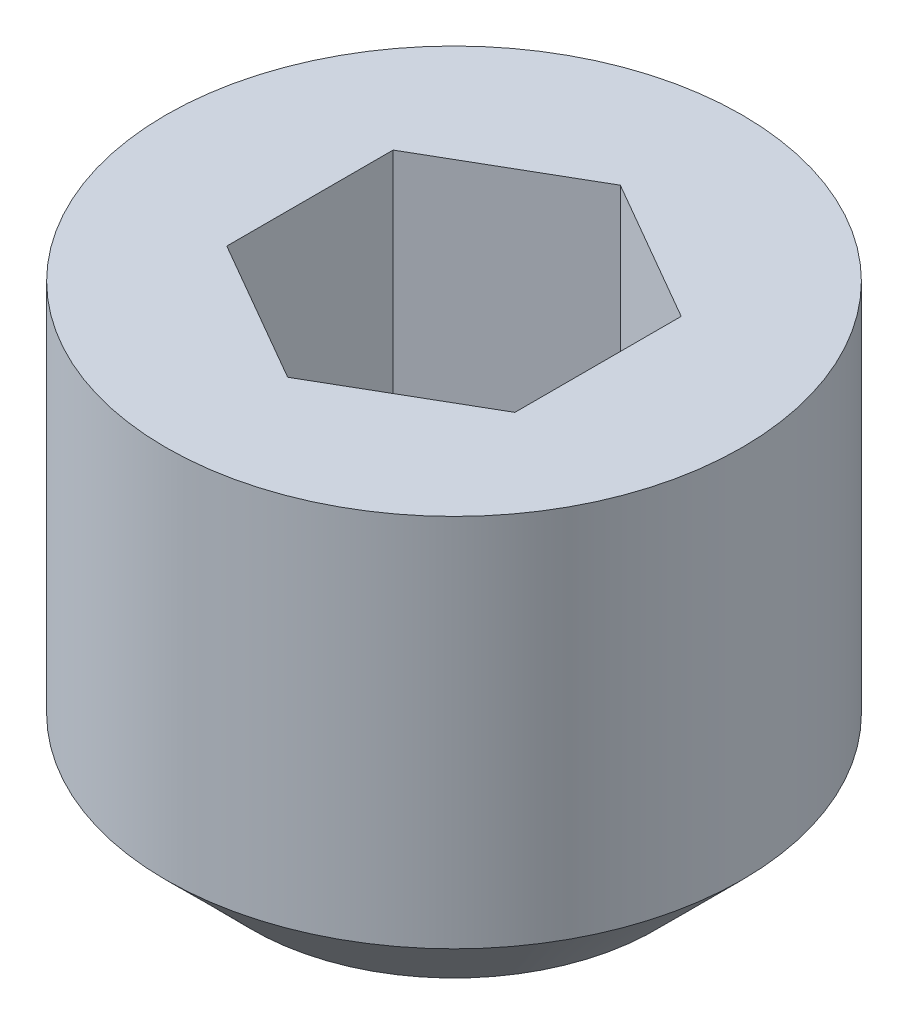
ISO-10303-21;
HEADER;
FILE_DESCRIPTION(('STEP AP214'),'2;1');
FILE_NAME('part.step','',(''),(''),'','','');
FILE_SCHEMA(('AUTOMOTIVE_DESIGN { 1 0 10303 214 1 1 1 1 }'));
ENDSEC;
DATA;
#1=APPLICATION_CONTEXT('core data for automotive mechanical design processes');
#2=APPLICATION_PROTOCOL_DEFINITION('international standard','automotive_design',2000,#1);
#3=PRODUCT_CONTEXT('',#1,'mechanical');
#4=PRODUCT('Part','Part','',(#3));
#5=PRODUCT_RELATED_PRODUCT_CATEGORY('part','',(#4));
#6=PRODUCT_DEFINITION_FORMATION('','',#4);
#7=PRODUCT_DEFINITION_CONTEXT('part definition',#1,'design');
#8=PRODUCT_DEFINITION('design','',#6,#7);
#9=PRODUCT_DEFINITION_SHAPE('','',#8);
#10=(LENGTH_UNIT() NAMED_UNIT(*) SI_UNIT(.MILLI.,.METRE.));
#11=(NAMED_UNIT(*) PLANE_ANGLE_UNIT() SI_UNIT($,.RADIAN.));
#12=(NAMED_UNIT(*) SI_UNIT($,.STERADIAN.) SOLID_ANGLE_UNIT());
#13=UNCERTAINTY_MEASURE_WITH_UNIT(LENGTH_MEASURE(1.E-05),#10,'distance_accuracy_value','');
#14=(GEOMETRIC_REPRESENTATION_CONTEXT(3) GLOBAL_UNCERTAINTY_ASSIGNED_CONTEXT((#13)) GLOBAL_UNIT_ASSIGNED_CONTEXT((#10,
#11,#12)) REPRESENTATION_CONTEXT('',''));
#15=CARTESIAN_POINT('',(0.,0.,0.));
#16=DIRECTION('',(0.,0.,1.));
#17=DIRECTION('',(1.,0.,0.));
#18=AXIS2_PLACEMENT_3D('',#15,#16,#17);
#19=CARTESIAN_POINT('',(0.,4.,0.));
#20=DIRECTION('',(0.,1.,0.));
#21=DIRECTION('',(-1.,0.,0.));
#22=AXIS2_PLACEMENT_3D('',#19,#20,#21);
#23=CYLINDRICAL_SURFACE('',#22,2.5);
#24=CARTESIAN_POINT('',(0.,4.,0.));
#25=DIRECTION('',(0.,1.,0.));
#26=DIRECTION('',(-1.,0.,0.));
#27=AXIS2_PLACEMENT_3D('',#24,#25,#26);
#28=CIRCLE('',#27,2.5);
#29=CARTESIAN_POINT('',(-2.5,4.,0.));
#30=VERTEX_POINT('',#29);
#31=EDGE_CURVE('E11',#30,#30,#28,.T.);
#32=ORIENTED_EDGE('',*,*,#31,.F.);
#33=EDGE_LOOP('',(#32));
#34=FACE_BOUND('',#33,.T.);
#35=CARTESIAN_POINT('',(0.,0.749999999999992,0.));
#36=DIRECTION('',(0.,1.,0.));
#37=DIRECTION('',(-1.,0.,0.));
#38=AXIS2_PLACEMENT_3D('',#35,#36,#37);
#39=CIRCLE('',#38,2.5);
#40=CARTESIAN_POINT('',(-2.5,0.749999999999991,0.));
#41=VERTEX_POINT('',#40);
#42=EDGE_CURVE('E152',#41,#41,#39,.T.);
#43=ORIENTED_EDGE('',*,*,#42,.T.);
#44=EDGE_LOOP('',(#43));
#45=FACE_BOUND('',#44,.T.);
#46=ADVANCED_FACE('F36',(#34,#45),#23,.T.);
#47=CARTESIAN_POINT('',(0.,4.,0.));
#48=DIRECTION('',(0.,-1.,0.));
#49=DIRECTION('',(1.,0.,0.));
#50=AXIS2_PLACEMENT_3D('',#47,#48,#49);
#51=PLANE('',#50);
#52=ORIENTED_EDGE('',*,*,#31,.T.);
#53=EDGE_LOOP('',(#52));
#54=FACE_BOUND('',#53,.T.);
#55=DIRECTION('',(-0.866025403784439,0.,0.5));
#56=VECTOR('',#55,1.);
#57=CARTESIAN_POINT('',(0.,4.,-1.44337567297406));
#58=LINE('',#57,#56);
#59=CARTESIAN_POINT('',(0.,4.,-1.44337567297406));
#60=VERTEX_POINT('',#59);
#61=CARTESIAN_POINT('',(-1.25,4.,-0.721687836487032));
#62=VERTEX_POINT('',#61);
#63=EDGE_CURVE('E151',#60,#62,#58,.T.);
#64=ORIENTED_EDGE('',*,*,#63,.F.);
#65=DIRECTION('',(-0.866025403784439,0.,-0.5));
#66=VECTOR('',#65,1.);
#67=CARTESIAN_POINT('',(1.25,4.,-0.721687836487032));
#68=LINE('',#67,#66);
#69=CARTESIAN_POINT('',(1.25,4.,-0.721687836487032));
#70=VERTEX_POINT('',#69);
#71=EDGE_CURVE('E51',#70,#60,#68,.T.);
#72=ORIENTED_EDGE('',*,*,#71,.F.);
#73=DIRECTION('',(0.,0.,-1.));
#74=VECTOR('',#73,1.);
#75=CARTESIAN_POINT('',(1.25,4.,0.721687836487032));
#76=LINE('',#75,#74);
#77=CARTESIAN_POINT('',(1.25,4.,0.721687836487032));
#78=VERTEX_POINT('',#77);
#79=EDGE_CURVE('E121',#78,#70,#76,.T.);
#80=ORIENTED_EDGE('',*,*,#79,.F.);
#81=DIRECTION('',(0.866025403784439,0.,-0.5));
#82=VECTOR('',#81,1.);
#83=CARTESIAN_POINT('',(0.,4.,1.44337567297406));
#84=LINE('',#83,#82);
#85=CARTESIAN_POINT('',(0.,4.,1.44337567297406));
#86=VERTEX_POINT('',#85);
#87=EDGE_CURVE('E159',#86,#78,#84,.T.);
#88=ORIENTED_EDGE('',*,*,#87,.F.);
#89=DIRECTION('',(0.866025403784439,0.,0.5));
#90=VECTOR('',#89,1.);
#91=CARTESIAN_POINT('',(-1.25,4.,0.721687836487032));
#92=LINE('',#91,#90);
#93=CARTESIAN_POINT('',(-1.25,4.,0.721687836487032));
#94=VERTEX_POINT('',#93);
#95=EDGE_CURVE('E156',#94,#86,#92,.T.);
#96=ORIENTED_EDGE('',*,*,#95,.F.);
#97=DIRECTION('',(0.,0.,1.));
#98=VECTOR('',#97,1.);
#99=CARTESIAN_POINT('',(-1.25,4.,-0.721687836487032));
#100=LINE('',#99,#98);
#101=EDGE_CURVE('E154',#62,#94,#100,.T.);
#102=ORIENTED_EDGE('',*,*,#101,.F.);
#103=EDGE_LOOP('',(#64,#72,#80,#88,#96,#102));
#104=FACE_BOUND('',#103,.T.);
#105=ADVANCED_FACE('F199',(#54,#104),#51,.F.);
#106=CARTESIAN_POINT('',(1.25,2.,-0.721687836487032));
#107=DIRECTION('',(0.5,0.,-0.866025403784439));
#108=DIRECTION('',(-0.866025403784439,0.,-0.5));
#109=AXIS2_PLACEMENT_3D('',#106,#107,#108);
#110=PLANE('',#109);
#111=DIRECTION('',(-0.866025403784439,0.,-0.5));
#112=VECTOR('',#111,1.);
#113=CARTESIAN_POINT('',(1.25,2.,-0.721687836487032));
#114=LINE('',#113,#112);
#115=CARTESIAN_POINT('',(1.25,2.,-0.721687836487032));
#116=VERTEX_POINT('',#115);
#117=CARTESIAN_POINT('',(0.625,2.,-1.08253175473055));
#118=VERTEX_POINT('',#117);
#119=EDGE_CURVE('E120',#116,#118,#114,.T.);
#120=ORIENTED_EDGE('',*,*,#119,.F.);
#121=DIRECTION('',(0.,1.,0.));
#122=VECTOR('',#121,1.);
#123=CARTESIAN_POINT('',(1.25,2.,-0.721687836487032));
#124=LINE('',#123,#122);
#125=EDGE_CURVE('E162',#116,#70,#124,.T.);
#126=ORIENTED_EDGE('',*,*,#125,.T.);
#127=ORIENTED_EDGE('',*,*,#71,.T.);
#128=DIRECTION('',(0.,1.,0.));
#129=VECTOR('',#128,1.);
#130=CARTESIAN_POINT('',(0.,2.,-1.44337567297406));
#131=LINE('',#130,#129);
#132=CARTESIAN_POINT('',(0.,2.,-1.44337567297406));
#133=VERTEX_POINT('',#132);
#134=EDGE_CURVE('E123',#133,#60,#131,.T.);
#135=ORIENTED_EDGE('',*,*,#134,.F.);
#136=EDGE_CURVE('E112',#118,#133,#114,.T.);
#137=ORIENTED_EDGE('',*,*,#136,.F.);
#138=EDGE_LOOP('',(#120,#126,#127,#135,#137));
#139=FACE_BOUND('',#138,.T.);
#140=ADVANCED_FACE('F124',(#139),#110,.F.);
#141=CARTESIAN_POINT('',(1.25,2.,0.721687836487032));
#142=DIRECTION('',(1.,0.,0.));
#143=DIRECTION('',(0.,1.,0.));
#144=AXIS2_PLACEMENT_3D('',#141,#142,#143);
#145=PLANE('',#144);
#146=DIRECTION('',(0.,0.,-1.));
#147=VECTOR('',#146,1.);
#148=CARTESIAN_POINT('',(1.25,2.,0.721687836487032));
#149=LINE('',#148,#147);
#150=CARTESIAN_POINT('',(1.25,2.,0.721687836487032));
#151=VERTEX_POINT('',#150);
#152=CARTESIAN_POINT('',(1.25,2.,0.));
#153=VERTEX_POINT('',#152);
#154=EDGE_CURVE('E128',#151,#153,#149,.T.);
#155=ORIENTED_EDGE('',*,*,#154,.F.);
#156=DIRECTION('',(0.,1.,0.));
#157=VECTOR('',#156,1.);
#158=CARTESIAN_POINT('',(1.25,2.,0.721687836487032));
#159=LINE('',#158,#157);
#160=EDGE_CURVE('E165',#151,#78,#159,.T.);
#161=ORIENTED_EDGE('',*,*,#160,.T.);
#162=ORIENTED_EDGE('',*,*,#79,.T.);
#163=ORIENTED_EDGE('',*,*,#125,.F.);
#164=EDGE_CURVE('E147',#153,#116,#149,.T.);
#165=ORIENTED_EDGE('',*,*,#164,.F.);
#166=EDGE_LOOP('',(#155,#161,#162,#163,#165));
#167=FACE_BOUND('',#166,.T.);
#168=ADVANCED_FACE('F193',(#167),#145,.F.);
#169=CARTESIAN_POINT('',(0.,2.,1.44337567297406));
#170=DIRECTION('',(0.5,0.,0.866025403784439));
#171=DIRECTION('',(0.866025403784439,0.,-0.5));
#172=AXIS2_PLACEMENT_3D('',#169,#170,#171);
#173=PLANE('',#172);
#174=DIRECTION('',(0.866025403784439,0.,-0.5));
#175=VECTOR('',#174,1.);
#176=CARTESIAN_POINT('',(0.,2.,1.44337567297406));
#177=LINE('',#176,#175);
#178=CARTESIAN_POINT('',(0.,2.,1.44337567297406));
#179=VERTEX_POINT('',#178);
#180=CARTESIAN_POINT('',(0.625,2.,1.08253175473055));
#181=VERTEX_POINT('',#180);
#182=EDGE_CURVE('E59',#179,#181,#177,.T.);
#183=ORIENTED_EDGE('',*,*,#182,.F.);
#184=DIRECTION('',(0.,1.,0.));
#185=VECTOR('',#184,1.);
#186=CARTESIAN_POINT('',(0.,2.,1.44337567297406));
#187=LINE('',#186,#185);
#188=EDGE_CURVE('E168',#179,#86,#187,.T.);
#189=ORIENTED_EDGE('',*,*,#188,.T.);
#190=ORIENTED_EDGE('',*,*,#87,.T.);
#191=ORIENTED_EDGE('',*,*,#160,.F.);
#192=EDGE_CURVE('E145',#181,#151,#177,.T.);
#193=ORIENTED_EDGE('',*,*,#192,.F.);
#194=EDGE_LOOP('',(#183,#189,#190,#191,#193));
#195=FACE_BOUND('',#194,.T.);
#196=ADVANCED_FACE('F242',(#195),#173,.F.);
#197=CARTESIAN_POINT('',(-1.25,2.,0.721687836487032));
#198=DIRECTION('',(-0.5,0.,0.866025403784439));
#199=DIRECTION('',(0.866025403784439,0.,0.5));
#200=AXIS2_PLACEMENT_3D('',#197,#198,#199);
#201=PLANE('',#200);
#202=DIRECTION('',(0.866025403784439,0.,0.5));
#203=VECTOR('',#202,1.);
#204=CARTESIAN_POINT('',(-1.25,2.,0.721687836487032));
#205=LINE('',#204,#203);
#206=CARTESIAN_POINT('',(-1.25,2.,0.721687836487032));
#207=VERTEX_POINT('',#206);
#208=CARTESIAN_POINT('',(-0.625,2.,1.08253175473055));
#209=VERTEX_POINT('',#208);
#210=EDGE_CURVE('E142',#207,#209,#205,.T.);
#211=ORIENTED_EDGE('',*,*,#210,.F.);
#212=DIRECTION('',(0.,1.,0.));
#213=VECTOR('',#212,1.);
#214=CARTESIAN_POINT('',(-1.25,2.,0.721687836487032));
#215=LINE('',#214,#213);
#216=EDGE_CURVE('E171',#207,#94,#215,.T.);
#217=ORIENTED_EDGE('',*,*,#216,.T.);
#218=ORIENTED_EDGE('',*,*,#95,.T.);
#219=ORIENTED_EDGE('',*,*,#188,.F.);
#220=EDGE_CURVE('E141',#209,#179,#205,.T.);
#221=ORIENTED_EDGE('',*,*,#220,.F.);
#222=EDGE_LOOP('',(#211,#217,#218,#219,#221));
#223=FACE_BOUND('',#222,.T.);
#224=ADVANCED_FACE('F239',(#223),#201,.F.);
#225=CARTESIAN_POINT('',(-1.25,2.,-0.721687836487032));
#226=DIRECTION('',(-1.,0.,0.));
#227=DIRECTION('',(0.,-1.,0.));
#228=AXIS2_PLACEMENT_3D('',#225,#226,#227);
#229=PLANE('',#228);
#230=DIRECTION('',(0.,0.,1.));
#231=VECTOR('',#230,1.);
#232=CARTESIAN_POINT('',(-1.25,2.,-0.721687836487032));
#233=LINE('',#232,#231);
#234=CARTESIAN_POINT('',(-1.25,2.,-0.721687836487032));
#235=VERTEX_POINT('',#234);
#236=CARTESIAN_POINT('',(-1.25,2.,0.));
#237=VERTEX_POINT('',#236);
#238=EDGE_CURVE('E136',#235,#237,#233,.T.);
#239=ORIENTED_EDGE('',*,*,#238,.F.);
#240=DIRECTION('',(0.,1.,0.));
#241=VECTOR('',#240,1.);
#242=CARTESIAN_POINT('',(-1.25,2.,-0.721687836487032));
#243=LINE('',#242,#241);
#244=EDGE_CURVE('E127',#235,#62,#243,.T.);
#245=ORIENTED_EDGE('',*,*,#244,.T.);
#246=ORIENTED_EDGE('',*,*,#101,.T.);
#247=ORIENTED_EDGE('',*,*,#216,.F.);
#248=EDGE_CURVE('E134',#237,#207,#233,.T.);
#249=ORIENTED_EDGE('',*,*,#248,.F.);
#250=EDGE_LOOP('',(#239,#245,#246,#247,#249));
#251=FACE_BOUND('',#250,.T.);
#252=ADVANCED_FACE('F204',(#251),#229,.F.);
#253=CARTESIAN_POINT('',(0.,2.,-1.44337567297406));
#254=DIRECTION('',(-0.5,0.,-0.866025403784439));
#255=DIRECTION('',(-0.866025403784439,0.,0.5));
#256=AXIS2_PLACEMENT_3D('',#253,#254,#255);
#257=PLANE('',#256);
#258=DIRECTION('',(-0.866025403784439,0.,0.5));
#259=VECTOR('',#258,1.);
#260=CARTESIAN_POINT('',(0.,2.,-1.44337567297406));
#261=LINE('',#260,#259);
#262=CARTESIAN_POINT('',(-0.625,2.,-1.08253175473055));
#263=VERTEX_POINT('',#262);
#264=EDGE_CURVE('E115',#133,#263,#261,.T.);
#265=ORIENTED_EDGE('',*,*,#264,.F.);
#266=ORIENTED_EDGE('',*,*,#134,.T.);
#267=ORIENTED_EDGE('',*,*,#63,.T.);
#268=ORIENTED_EDGE('',*,*,#244,.F.);
#269=EDGE_CURVE('E133',#263,#235,#261,.T.);
#270=ORIENTED_EDGE('',*,*,#269,.F.);
#271=EDGE_LOOP('',(#265,#266,#267,#268,#270));
#272=FACE_BOUND('',#271,.T.);
#273=ADVANCED_FACE('F131',(#272),#257,.F.);
#274=CARTESIAN_POINT('',(0.,2.,0.));
#275=DIRECTION('',(0.,1.,0.));
#276=DIRECTION('',(0.,0.,1.));
#277=AXIS2_PLACEMENT_3D('',#274,#275,#276);
#278=PLANE('',#277);
#279=ORIENTED_EDGE('',*,*,#192,.T.);
#280=ORIENTED_EDGE('',*,*,#154,.T.);
#281=CARTESIAN_POINT('',(0.,2.,0.));
#282=DIRECTION('',(0.,1.,0.));
#283=DIRECTION('',(-1.,0.,0.));
#284=AXIS2_PLACEMENT_3D('',#281,#282,#283);
#285=CIRCLE('',#284,1.25);
#286=EDGE_CURVE('E180',#181,#153,#285,.T.);
#287=ORIENTED_EDGE('',*,*,#286,.F.);
#288=EDGE_LOOP('',(#279,#280,#287));
#289=FACE_BOUND('',#288,.T.);
#290=ADVANCED_FACE('F188',(#289),#278,.T.);
#291=ORIENTED_EDGE('',*,*,#164,.T.);
#292=ORIENTED_EDGE('',*,*,#119,.T.);
#293=EDGE_CURVE('E181',#153,#118,#285,.T.);
#294=ORIENTED_EDGE('',*,*,#293,.F.);
#295=EDGE_LOOP('',(#291,#292,#294));
#296=FACE_BOUND('',#295,.T.);
#297=ADVANCED_FACE('F197',(#296),#278,.T.);
#298=ORIENTED_EDGE('',*,*,#136,.T.);
#299=ORIENTED_EDGE('',*,*,#264,.T.);
#300=EDGE_CURVE('E117',#118,#263,#285,.T.);
#301=ORIENTED_EDGE('',*,*,#300,.F.);
#302=EDGE_LOOP('',(#298,#299,#301));
#303=FACE_BOUND('',#302,.T.);
#304=ADVANCED_FACE('F113',(#303),#278,.T.);
#305=ORIENTED_EDGE('',*,*,#269,.T.);
#306=ORIENTED_EDGE('',*,*,#238,.T.);
#307=EDGE_CURVE('E164',#263,#237,#285,.T.);
#308=ORIENTED_EDGE('',*,*,#307,.F.);
#309=EDGE_LOOP('',(#305,#306,#308));
#310=FACE_BOUND('',#309,.T.);
#311=ADVANCED_FACE('F208',(#310),#278,.T.);
#312=ORIENTED_EDGE('',*,*,#248,.T.);
#313=ORIENTED_EDGE('',*,*,#210,.T.);
#314=EDGE_CURVE('E44',#237,#209,#285,.T.);
#315=ORIENTED_EDGE('',*,*,#314,.F.);
#316=EDGE_LOOP('',(#312,#313,#315));
#317=FACE_BOUND('',#316,.T.);
#318=ADVANCED_FACE('F210',(#317),#278,.T.);
#319=ORIENTED_EDGE('',*,*,#220,.T.);
#320=ORIENTED_EDGE('',*,*,#182,.T.);
#321=EDGE_CURVE('E176',#209,#181,#285,.T.);
#322=ORIENTED_EDGE('',*,*,#321,.F.);
#323=EDGE_LOOP('',(#319,#320,#322));
#324=FACE_BOUND('',#323,.T.);
#325=ADVANCED_FACE('F216',(#324),#278,.T.);
#326=CARTESIAN_POINT('',(0.,1.27831216351296,0.));
#327=DIRECTION('',(0.,1.,0.));
#328=DIRECTION('',(-1.,0.,0.));
#329=AXIS2_PLACEMENT_3D('',#326,#327,#328);
#330=CONICAL_SURFACE('',#329,0.,1.04719755119659);
#331=ORIENTED_EDGE('',*,*,#314,.T.);
#332=ORIENTED_EDGE('',*,*,#321,.T.);
#333=ORIENTED_EDGE('',*,*,#286,.T.);
#334=ORIENTED_EDGE('',*,*,#293,.T.);
#335=ORIENTED_EDGE('',*,*,#300,.T.);
#336=ORIENTED_EDGE('',*,*,#307,.T.);
#337=EDGE_LOOP('',(#331,#332,#333,#334,#335,#336));
#338=FACE_BOUND('',#337,.T.);
#339=CARTESIAN_POINT('',(0.,1.27831216351296,0.));
#340=VERTEX_POINT('',#339);
#341=VERTEX_LOOP('',#340);
#342=FACE_BOUND('',#341,.T.);
#343=ADVANCED_FACE('F185',(#338,#342),#330,.F.);
#344=CARTESIAN_POINT('',(0.,0.749999999999992,0.));
#345=DIRECTION('',(0.,1.,0.));
#346=DIRECTION('',(-1.,0.,0.));
#347=AXIS2_PLACEMENT_3D('',#344,#345,#346);
#348=CONICAL_SURFACE('',#347,2.5,0.785398163397454);
#349=CARTESIAN_POINT('',(0.,0.,0.));
#350=DIRECTION('',(0.,1.,0.));
#351=DIRECTION('',(-1.,0.,0.));
#352=AXIS2_PLACEMENT_3D('',#349,#350,#351);
#353=CIRCLE('',#352,1.75);
#354=CARTESIAN_POINT('',(-1.75,0.,0.));
#355=VERTEX_POINT('',#354);
#356=EDGE_CURVE('E334',#355,#355,#353,.T.);
#357=ORIENTED_EDGE('',*,*,#356,.T.);
#358=EDGE_LOOP('',(#357));
#359=FACE_BOUND('',#358,.T.);
#360=ORIENTED_EDGE('',*,*,#42,.F.);
#361=EDGE_LOOP('',(#360));
#362=FACE_BOUND('',#361,.T.);
#363=ADVANCED_FACE('F232',(#359,#362),#348,.T.);
#364=CARTESIAN_POINT('',(0.,0.,0.));
#365=DIRECTION('',(0.,1.,0.));
#366=DIRECTION('',(-1.,0.,0.));
#367=AXIS2_PLACEMENT_3D('',#364,#365,#366);
#368=PLANE('',#367);
#369=ORIENTED_EDGE('',*,*,#356,.F.);
#370=EDGE_LOOP('',(#369));
#371=FACE_BOUND('',#370,.T.);
#372=ADVANCED_FACE('F38',(#371),#368,.F.);
#373=CLOSED_SHELL('',(#46,#105,#140,#168,#196,#224,#252,#273,#290,#297,#304,#311,#318,#325,#343,
#363,#372));
#374=MANIFOLD_SOLID_BREP('B2',#373);
#375=ADVANCED_BREP_SHAPE_REPRESENTATION('',(#18,#374),#14);
#376=SHAPE_DEFINITION_REPRESENTATION(#9,#375);
ENDSEC;
END-ISO-10303-21;
